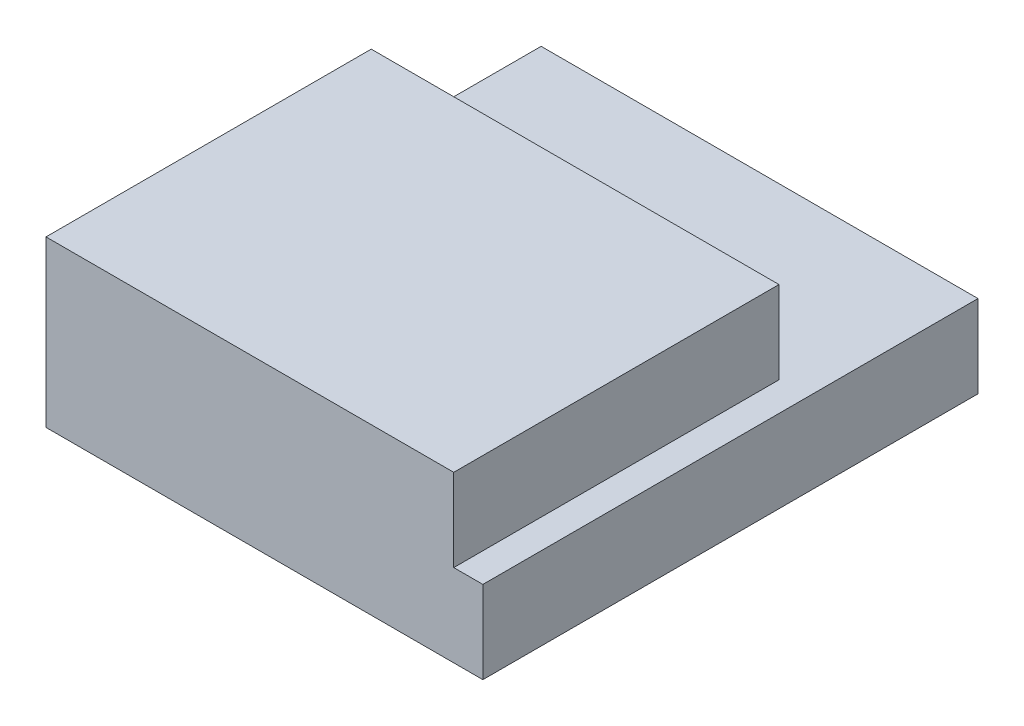
ISO-10303-21;
HEADER;
FILE_DESCRIPTION(('STEP AP214'),'2;1');
FILE_NAME('part.step','',(''),(''),'','','');
FILE_SCHEMA(('AUTOMOTIVE_DESIGN { 1 0 10303 214 1 1 1 1 }'));
ENDSEC;
DATA;
#1=APPLICATION_CONTEXT('core data for automotive mechanical design processes');
#2=APPLICATION_PROTOCOL_DEFINITION('international standard','automotive_design',2000,#1);
#3=PRODUCT_CONTEXT('',#1,'mechanical');
#4=PRODUCT('Part','Part','',(#3));
#5=PRODUCT_RELATED_PRODUCT_CATEGORY('part','',(#4));
#6=PRODUCT_DEFINITION_FORMATION('','',#4);
#7=PRODUCT_DEFINITION_CONTEXT('part definition',#1,'design');
#8=PRODUCT_DEFINITION('design','',#6,#7);
#9=PRODUCT_DEFINITION_SHAPE('','',#8);
#10=(LENGTH_UNIT() NAMED_UNIT(*) SI_UNIT(.MILLI.,.METRE.));
#11=(NAMED_UNIT(*) PLANE_ANGLE_UNIT() SI_UNIT($,.RADIAN.));
#12=(NAMED_UNIT(*) SI_UNIT($,.STERADIAN.) SOLID_ANGLE_UNIT());
#13=UNCERTAINTY_MEASURE_WITH_UNIT(LENGTH_MEASURE(1.E-05),#10,'distance_accuracy_value','');
#14=(GEOMETRIC_REPRESENTATION_CONTEXT(3) GLOBAL_UNCERTAINTY_ASSIGNED_CONTEXT((#13)) GLOBAL_UNIT_ASSIGNED_CONTEXT((#10,
#11,#12)) REPRESENTATION_CONTEXT('',''));
#15=CARTESIAN_POINT('',(0.,0.,0.));
#16=DIRECTION('',(0.,0.,1.));
#17=DIRECTION('',(1.,0.,0.));
#18=AXIS2_PLACEMENT_3D('',#15,#16,#17);
#19=CARTESIAN_POINT('',(-16.125,17.,-54.1875));
#20=DIRECTION('',(1.,0.,0.));
#21=DIRECTION('',(0.,0.,-1.));
#22=AXIS2_PLACEMENT_3D('',#19,#20,#21);
#23=PLANE('',#22);
#24=DIRECTION('',(0.,0.,1.));
#25=VECTOR('',#24,1.);
#26=CARTESIAN_POINT('',(-16.125,0.,-54.1875));
#27=LINE('',#26,#25);
#28=CARTESIAN_POINT('',(-16.125,0.,-54.1875));
#29=VERTEX_POINT('',#28);
#30=CARTESIAN_POINT('',(-16.1249999999999,0.,47.8125));
#31=VERTEX_POINT('',#30);
#32=EDGE_CURVE('E107',#29,#31,#27,.T.);
#33=ORIENTED_EDGE('',*,*,#32,.T.);
#34=DIRECTION('',(0.,-1.,0.));
#35=VECTOR('',#34,1.);
#36=CARTESIAN_POINT('',(-16.1249999999999,17.,47.8125));
#37=LINE('',#36,#35);
#38=CARTESIAN_POINT('',(-16.1249999999999,34.,47.8125));
#39=VERTEX_POINT('',#38);
#40=EDGE_CURVE('E11',#39,#31,#37,.T.);
#41=ORIENTED_EDGE('',*,*,#40,.F.);
#42=DIRECTION('',(0.,0.,1.));
#43=VECTOR('',#42,1.);
#44=CARTESIAN_POINT('',(-16.1249999999999,34.,47.8125));
#45=LINE('',#44,#43);
#46=CARTESIAN_POINT('',(-16.1249999999999,34.,-19.1875));
#47=VERTEX_POINT('',#46);
#48=EDGE_CURVE('E104',#47,#39,#45,.T.);
#49=ORIENTED_EDGE('',*,*,#48,.F.);
#50=DIRECTION('',(0.,-1.,0.));
#51=VECTOR('',#50,1.);
#52=CARTESIAN_POINT('',(-16.1249999999999,34.,-19.1875));
#53=LINE('',#52,#51);
#54=CARTESIAN_POINT('',(-16.125,17.,-19.1875));
#55=VERTEX_POINT('',#54);
#56=EDGE_CURVE('E133',#47,#55,#53,.T.);
#57=ORIENTED_EDGE('',*,*,#56,.T.);
#58=DIRECTION('',(0.,0.,1.));
#59=VECTOR('',#58,1.);
#60=CARTESIAN_POINT('',(-16.125,17.,-54.1875));
#61=LINE('',#60,#59);
#62=CARTESIAN_POINT('',(-16.125,17.,-54.1875));
#63=VERTEX_POINT('',#62);
#64=EDGE_CURVE('E64',#63,#55,#61,.T.);
#65=ORIENTED_EDGE('',*,*,#64,.F.);
#66=DIRECTION('',(0.,-1.,0.));
#67=VECTOR('',#66,1.);
#68=CARTESIAN_POINT('',(-16.125,17.,-54.1875));
#69=LINE('',#68,#67);
#70=EDGE_CURVE('E156',#63,#29,#69,.T.);
#71=ORIENTED_EDGE('',*,*,#70,.T.);
#72=EDGE_LOOP('',(#33,#41,#49,#57,#65,#71));
#73=FACE_BOUND('',#72,.T.);
#74=ADVANCED_FACE('F43',(#73),#23,.F.);
#75=CARTESIAN_POINT('',(-16.1249999999999,17.,47.8125));
#76=DIRECTION('',(0.,0.,-1.));
#77=DIRECTION('',(-1.,0.,0.));
#78=AXIS2_PLACEMENT_3D('',#75,#76,#77);
#79=PLANE('',#78);
#80=DIRECTION('',(1.,0.,0.));
#81=VECTOR('',#80,1.);
#82=CARTESIAN_POINT('',(-16.1249999999999,0.,47.8125));
#83=LINE('',#82,#81);
#84=CARTESIAN_POINT('',(73.875,0.,47.8125));
#85=VERTEX_POINT('',#84);
#86=EDGE_CURVE('E159',#31,#85,#83,.T.);
#87=ORIENTED_EDGE('',*,*,#86,.T.);
#88=DIRECTION('',(0.,-1.,0.));
#89=VECTOR('',#88,1.);
#90=CARTESIAN_POINT('',(73.875,17.,47.8125));
#91=LINE('',#90,#89);
#92=CARTESIAN_POINT('',(73.875,17.,47.8125));
#93=VERTEX_POINT('',#92);
#94=EDGE_CURVE('E51',#93,#85,#91,.T.);
#95=ORIENTED_EDGE('',*,*,#94,.F.);
#96=DIRECTION('',(1.,0.,0.));
#97=VECTOR('',#96,1.);
#98=CARTESIAN_POINT('',(-16.1249999999999,17.,47.8125));
#99=LINE('',#98,#97);
#100=CARTESIAN_POINT('',(67.875,17.,47.8125));
#101=VERTEX_POINT('',#100);
#102=EDGE_CURVE('E146',#101,#93,#99,.T.);
#103=ORIENTED_EDGE('',*,*,#102,.F.);
#104=DIRECTION('',(0.,-1.,0.));
#105=VECTOR('',#104,1.);
#106=CARTESIAN_POINT('',(67.8750000000001,34.,47.8125));
#107=LINE('',#106,#105);
#108=CARTESIAN_POINT('',(67.8750000000001,34.,47.8125));
#109=VERTEX_POINT('',#108);
#110=EDGE_CURVE('E113',#109,#101,#107,.T.);
#111=ORIENTED_EDGE('',*,*,#110,.F.);
#112=DIRECTION('',(1.,0.,0.));
#113=VECTOR('',#112,1.);
#114=CARTESIAN_POINT('',(-16.1249999999999,34.,47.8125));
#115=LINE('',#114,#113);
#116=EDGE_CURVE('E110',#39,#109,#115,.T.);
#117=ORIENTED_EDGE('',*,*,#116,.F.);
#118=ORIENTED_EDGE('',*,*,#40,.T.);
#119=EDGE_LOOP('',(#87,#95,#103,#111,#117,#118));
#120=FACE_BOUND('',#119,.T.);
#121=ADVANCED_FACE('F111',(#120),#79,.F.);
#122=CARTESIAN_POINT('',(73.875,17.,-54.1875));
#123=DIRECTION('',(-1.,0.,0.));
#124=DIRECTION('',(0.,0.,1.));
#125=AXIS2_PLACEMENT_3D('',#122,#123,#124);
#126=PLANE('',#125);
#127=DIRECTION('',(0.,0.,-1.));
#128=VECTOR('',#127,1.);
#129=CARTESIAN_POINT('',(73.875,0.,-54.1875));
#130=LINE('',#129,#128);
#131=CARTESIAN_POINT('',(73.875,0.,-54.1875));
#132=VERTEX_POINT('',#131);
#133=EDGE_CURVE('E162',#85,#132,#130,.T.);
#134=ORIENTED_EDGE('',*,*,#133,.T.);
#135=DIRECTION('',(0.,-1.,0.));
#136=VECTOR('',#135,1.);
#137=CARTESIAN_POINT('',(73.875,17.,-54.1875));
#138=LINE('',#137,#136);
#139=CARTESIAN_POINT('',(73.875,17.,-54.1875));
#140=VERTEX_POINT('',#139);
#141=EDGE_CURVE('E169',#140,#132,#138,.T.);
#142=ORIENTED_EDGE('',*,*,#141,.F.);
#143=DIRECTION('',(0.,0.,-1.));
#144=VECTOR('',#143,1.);
#145=CARTESIAN_POINT('',(73.875,17.,-54.1875));
#146=LINE('',#145,#144);
#147=EDGE_CURVE('E150',#93,#140,#146,.T.);
#148=ORIENTED_EDGE('',*,*,#147,.F.);
#149=ORIENTED_EDGE('',*,*,#94,.T.);
#150=EDGE_LOOP('',(#134,#142,#148,#149));
#151=FACE_BOUND('',#150,.T.);
#152=ADVANCED_FACE('F178',(#151),#126,.F.);
#153=CARTESIAN_POINT('',(-16.125,17.,-54.1875));
#154=DIRECTION('',(0.,0.,1.));
#155=DIRECTION('',(1.,0.,0.));
#156=AXIS2_PLACEMENT_3D('',#153,#154,#155);
#157=PLANE('',#156);
#158=DIRECTION('',(-1.,0.,0.));
#159=VECTOR('',#158,1.);
#160=CARTESIAN_POINT('',(-16.125,0.,-54.1875));
#161=LINE('',#160,#159);
#162=EDGE_CURVE('E147',#132,#29,#161,.T.);
#163=ORIENTED_EDGE('',*,*,#162,.T.);
#164=ORIENTED_EDGE('',*,*,#70,.F.);
#165=DIRECTION('',(-1.,0.,0.));
#166=VECTOR('',#165,1.);
#167=CARTESIAN_POINT('',(-16.125,17.,-54.1875));
#168=LINE('',#167,#166);
#169=EDGE_CURVE('E153',#140,#63,#168,.T.);
#170=ORIENTED_EDGE('',*,*,#169,.F.);
#171=ORIENTED_EDGE('',*,*,#141,.T.);
#172=EDGE_LOOP('',(#163,#164,#170,#171));
#173=FACE_BOUND('',#172,.T.);
#174=ADVANCED_FACE('F185',(#173),#157,.F.);
#175=CARTESIAN_POINT('',(0.,17.,0.));
#176=DIRECTION('',(0.,1.,0.));
#177=DIRECTION('',(0.,0.,1.));
#178=AXIS2_PLACEMENT_3D('',#175,#176,#177);
#179=PLANE('',#178);
#180=DIRECTION('',(-1.,0.,0.));
#181=VECTOR('',#180,1.);
#182=CARTESIAN_POINT('',(-16.1249999999999,17.,-19.1875));
#183=LINE('',#182,#181);
#184=CARTESIAN_POINT('',(67.8750000000001,17.,-19.1875));
#185=VERTEX_POINT('',#184);
#186=EDGE_CURVE('E124',#185,#55,#183,.T.);
#187=ORIENTED_EDGE('',*,*,#186,.F.);
#188=DIRECTION('',(0.,0.,-1.));
#189=VECTOR('',#188,1.);
#190=CARTESIAN_POINT('',(67.8750000000001,17.,47.8125));
#191=LINE('',#190,#189);
#192=EDGE_CURVE('E58',#101,#185,#191,.T.);
#193=ORIENTED_EDGE('',*,*,#192,.F.);
#194=ORIENTED_EDGE('',*,*,#102,.T.);
#195=ORIENTED_EDGE('',*,*,#147,.T.);
#196=ORIENTED_EDGE('',*,*,#169,.T.);
#197=ORIENTED_EDGE('',*,*,#64,.T.);
#198=EDGE_LOOP('',(#187,#193,#194,#195,#196,#197));
#199=FACE_BOUND('',#198,.T.);
#200=ADVANCED_FACE('F190',(#199),#179,.T.);
#201=CARTESIAN_POINT('',(0.,0.,0.));
#202=DIRECTION('',(0.,1.,0.));
#203=DIRECTION('',(0.,0.,1.));
#204=AXIS2_PLACEMENT_3D('',#201,#202,#203);
#205=PLANE('',#204);
#206=ORIENTED_EDGE('',*,*,#32,.F.);
#207=ORIENTED_EDGE('',*,*,#162,.F.);
#208=ORIENTED_EDGE('',*,*,#133,.F.);
#209=ORIENTED_EDGE('',*,*,#86,.F.);
#210=EDGE_LOOP('',(#206,#207,#208,#209));
#211=FACE_BOUND('',#210,.T.);
#212=ADVANCED_FACE('F182',(#211),#205,.F.);
#213=CARTESIAN_POINT('',(67.8750000000001,34.,47.8125));
#214=DIRECTION('',(-1.,0.,0.));
#215=DIRECTION('',(0.,0.,1.));
#216=AXIS2_PLACEMENT_3D('',#213,#214,#215);
#217=PLANE('',#216);
#218=ORIENTED_EDGE('',*,*,#192,.T.);
#219=DIRECTION('',(0.,-1.,0.));
#220=VECTOR('',#219,1.);
#221=CARTESIAN_POINT('',(67.8750000000001,34.,-19.1875));
#222=LINE('',#221,#220);
#223=CARTESIAN_POINT('',(67.8750000000001,34.,-19.1875));
#224=VERTEX_POINT('',#223);
#225=EDGE_CURVE('E138',#224,#185,#222,.T.);
#226=ORIENTED_EDGE('',*,*,#225,.F.);
#227=DIRECTION('',(0.,0.,-1.));
#228=VECTOR('',#227,1.);
#229=CARTESIAN_POINT('',(67.8750000000001,34.,47.8125));
#230=LINE('',#229,#228);
#231=EDGE_CURVE('E117',#109,#224,#230,.T.);
#232=ORIENTED_EDGE('',*,*,#231,.F.);
#233=ORIENTED_EDGE('',*,*,#110,.T.);
#234=EDGE_LOOP('',(#218,#226,#232,#233));
#235=FACE_BOUND('',#234,.T.);
#236=ADVANCED_FACE('F192',(#235),#217,.F.);
#237=CARTESIAN_POINT('',(-16.1249999999999,34.,-19.1875));
#238=DIRECTION('',(0.,0.,1.));
#239=DIRECTION('',(1.,0.,0.));
#240=AXIS2_PLACEMENT_3D('',#237,#238,#239);
#241=PLANE('',#240);
#242=ORIENTED_EDGE('',*,*,#186,.T.);
#243=ORIENTED_EDGE('',*,*,#56,.F.);
#244=DIRECTION('',(-1.,0.,0.));
#245=VECTOR('',#244,1.);
#246=CARTESIAN_POINT('',(-16.1249999999999,34.,-19.1875));
#247=LINE('',#246,#245);
#248=EDGE_CURVE('E121',#224,#47,#247,.T.);
#249=ORIENTED_EDGE('',*,*,#248,.F.);
#250=ORIENTED_EDGE('',*,*,#225,.T.);
#251=EDGE_LOOP('',(#242,#243,#249,#250));
#252=FACE_BOUND('',#251,.T.);
#253=ADVANCED_FACE('F188',(#252),#241,.F.);
#254=CARTESIAN_POINT('',(0.,34.,0.));
#255=DIRECTION('',(0.,-1.,0.));
#256=DIRECTION('',(0.,0.,-1.));
#257=AXIS2_PLACEMENT_3D('',#254,#255,#256);
#258=PLANE('',#257);
#259=ORIENTED_EDGE('',*,*,#48,.T.);
#260=ORIENTED_EDGE('',*,*,#116,.T.);
#261=ORIENTED_EDGE('',*,*,#231,.T.);
#262=ORIENTED_EDGE('',*,*,#248,.T.);
#263=EDGE_LOOP('',(#259,#260,#261,#262));
#264=FACE_BOUND('',#263,.T.);
#265=ADVANCED_FACE('F119',(#264),#258,.F.);
#266=CLOSED_SHELL('',(#74,#121,#152,#174,#200,#212,#236,#253,#265));
#267=MANIFOLD_SOLID_BREP('B2',#266);
#268=ADVANCED_BREP_SHAPE_REPRESENTATION('',(#18,#267),#14);
#269=SHAPE_DEFINITION_REPRESENTATION(#9,#268);
ENDSEC;
END-ISO-10303-21;
